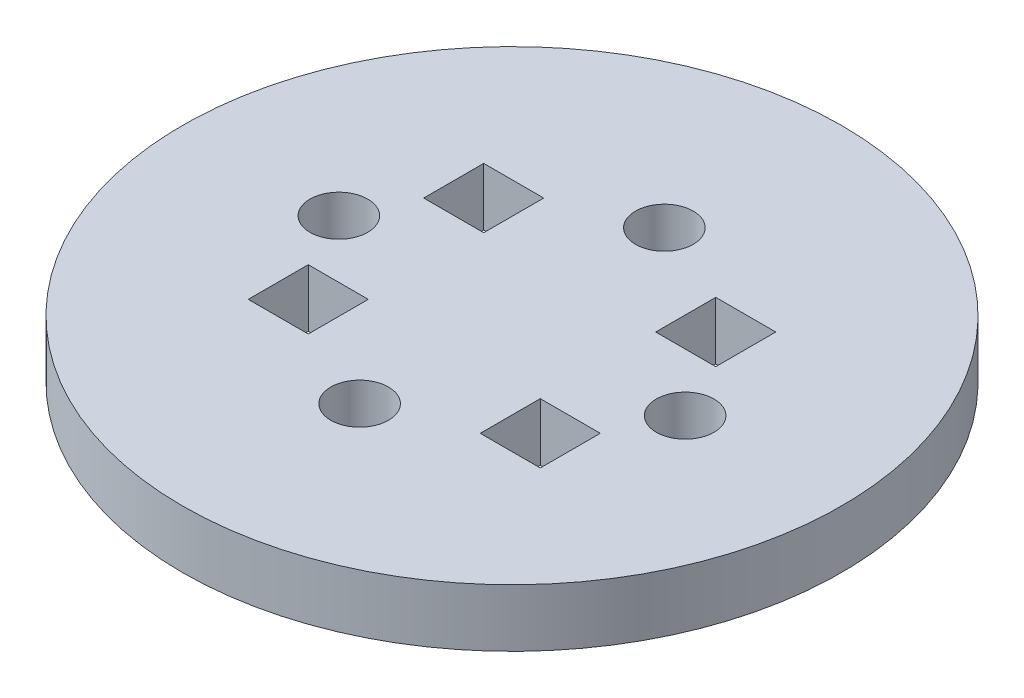
ISO-10303-21;
HEADER;
FILE_DESCRIPTION(('STEP AP214'),'2;1');
FILE_NAME('part.step','',(''),(''),'','','');
FILE_SCHEMA(('AUTOMOTIVE_DESIGN { 1 0 10303 214 1 1 1 1 }'));
ENDSEC;
DATA;
#1=APPLICATION_CONTEXT('core data for automotive mechanical design processes');
#2=APPLICATION_PROTOCOL_DEFINITION('international standard','automotive_design',2000,#1);
#3=PRODUCT_CONTEXT('',#1,'mechanical');
#4=PRODUCT('Part','Part','',(#3));
#5=PRODUCT_RELATED_PRODUCT_CATEGORY('part','',(#4));
#6=PRODUCT_DEFINITION_FORMATION('','',#4);
#7=PRODUCT_DEFINITION_CONTEXT('part definition',#1,'design');
#8=PRODUCT_DEFINITION('design','',#6,#7);
#9=PRODUCT_DEFINITION_SHAPE('','',#8);
#10=(LENGTH_UNIT() NAMED_UNIT(*) SI_UNIT(.MILLI.,.METRE.));
#11=(NAMED_UNIT(*) PLANE_ANGLE_UNIT() SI_UNIT($,.RADIAN.));
#12=(NAMED_UNIT(*) SI_UNIT($,.STERADIAN.) SOLID_ANGLE_UNIT());
#13=UNCERTAINTY_MEASURE_WITH_UNIT(LENGTH_MEASURE(1.E-05),#10,'distance_accuracy_value','');
#14=(GEOMETRIC_REPRESENTATION_CONTEXT(3) GLOBAL_UNCERTAINTY_ASSIGNED_CONTEXT((#13)) GLOBAL_UNIT_ASSIGNED_CONTEXT((#10,
#11,#12)) REPRESENTATION_CONTEXT('',''));
#15=CARTESIAN_POINT('',(0.,0.,0.));
#16=DIRECTION('',(0.,0.,1.));
#17=DIRECTION('',(1.,0.,0.));
#18=AXIS2_PLACEMENT_3D('',#15,#16,#17);
#19=CARTESIAN_POINT('',(0.,6.35,0.));
#20=DIRECTION('',(0.,1.,0.));
#21=DIRECTION('',(0.,0.,1.));
#22=AXIS2_PLACEMENT_3D('',#19,#20,#21);
#23=PLANE('',#22);
#24=DIRECTION('',(0.,0.,-1.));
#25=VECTOR('',#24,1.);
#26=CARTESIAN_POINT('',(-9.4615,6.35,6.35));
#27=LINE('',#26,#25);
#28=CARTESIAN_POINT('',(-9.4615,6.35,12.954));
#29=VERTEX_POINT('',#28);
#30=CARTESIAN_POINT('',(-9.4615,6.35,6.35));
#31=VERTEX_POINT('',#30);
#32=EDGE_CURVE('E56',#29,#31,#27,.T.);
#33=ORIENTED_EDGE('',*,*,#32,.F.);
#34=DIRECTION('',(1.,0.,0.));
#35=VECTOR('',#34,1.);
#36=CARTESIAN_POINT('',(-16.0655,6.35,12.954));
#37=LINE('',#36,#35);
#38=CARTESIAN_POINT('',(-16.0655,6.35,12.954));
#39=VERTEX_POINT('',#38);
#40=EDGE_CURVE('E191',#39,#29,#37,.T.);
#41=ORIENTED_EDGE('',*,*,#40,.F.);
#42=DIRECTION('',(0.,0.,1.));
#43=VECTOR('',#42,1.);
#44=CARTESIAN_POINT('',(-16.0655,6.35,12.954));
#45=LINE('',#44,#43);
#46=CARTESIAN_POINT('',(-16.0655,6.35,6.35));
#47=VERTEX_POINT('',#46);
#48=EDGE_CURVE('E200',#47,#39,#45,.T.);
#49=ORIENTED_EDGE('',*,*,#48,.F.);
#50=DIRECTION('',(-1.,0.,0.));
#51=VECTOR('',#50,1.);
#52=CARTESIAN_POINT('',(-16.0655,6.35,6.35));
#53=LINE('',#52,#51);
#54=EDGE_CURVE('E203',#31,#47,#53,.T.);
#55=ORIENTED_EDGE('',*,*,#54,.F.);
#56=EDGE_LOOP('',(#33,#41,#49,#55));
#57=FACE_BOUND('',#56,.T.);
#58=DIRECTION('',(1.,0.,0.));
#59=VECTOR('',#58,1.);
#60=CARTESIAN_POINT('',(9.4615,6.35,-6.35));
#61=LINE('',#60,#59);
#62=CARTESIAN_POINT('',(9.4615,6.35,-6.35));
#63=VERTEX_POINT('',#62);
#64=CARTESIAN_POINT('',(16.0655,6.35,-6.35));
#65=VERTEX_POINT('',#64);
#66=EDGE_CURVE('E64',#63,#65,#61,.T.);
#67=ORIENTED_EDGE('',*,*,#66,.F.);
#68=DIRECTION('',(0.,0.,1.));
#69=VECTOR('',#68,1.);
#70=CARTESIAN_POINT('',(9.4615,6.35,-12.954));
#71=LINE('',#70,#69);
#72=CARTESIAN_POINT('',(9.4615,6.35,-12.954));
#73=VERTEX_POINT('',#72);
#74=EDGE_CURVE('E210',#73,#63,#71,.T.);
#75=ORIENTED_EDGE('',*,*,#74,.F.);
#76=DIRECTION('',(-1.,0.,0.));
#77=VECTOR('',#76,1.);
#78=CARTESIAN_POINT('',(9.4615,6.35,-12.954));
#79=LINE('',#78,#77);
#80=CARTESIAN_POINT('',(16.0655,6.35,-12.954));
#81=VERTEX_POINT('',#80);
#82=EDGE_CURVE('E216',#81,#73,#79,.T.);
#83=ORIENTED_EDGE('',*,*,#82,.F.);
#84=DIRECTION('',(0.,0.,-1.));
#85=VECTOR('',#84,1.);
#86=CARTESIAN_POINT('',(16.0655,6.35,-6.35));
#87=LINE('',#86,#85);
#88=EDGE_CURVE('E219',#65,#81,#87,.T.);
#89=ORIENTED_EDGE('',*,*,#88,.F.);
#90=EDGE_LOOP('',(#67,#75,#83,#89));
#91=FACE_BOUND('',#90,.T.);
#92=DIRECTION('',(-1.,0.,0.));
#93=VECTOR('',#92,1.);
#94=CARTESIAN_POINT('',(9.4615,6.35,6.35));
#95=LINE('',#94,#93);
#96=CARTESIAN_POINT('',(16.0655,6.35,6.35));
#97=VERTEX_POINT('',#96);
#98=CARTESIAN_POINT('',(9.4615,6.35,6.35));
#99=VERTEX_POINT('',#98);
#100=EDGE_CURVE('E160',#97,#99,#95,.T.);
#101=ORIENTED_EDGE('',*,*,#100,.F.);
#102=DIRECTION('',(0.,0.,-1.));
#103=VECTOR('',#102,1.);
#104=CARTESIAN_POINT('',(16.0655,6.35,6.35));
#105=LINE('',#104,#103);
#106=CARTESIAN_POINT('',(16.0655,6.35,12.954));
#107=VERTEX_POINT('',#106);
#108=EDGE_CURVE('E169',#107,#97,#105,.T.);
#109=ORIENTED_EDGE('',*,*,#108,.F.);
#110=DIRECTION('',(1.,0.,0.));
#111=VECTOR('',#110,1.);
#112=CARTESIAN_POINT('',(9.4615,6.35,12.954));
#113=LINE('',#112,#111);
#114=CARTESIAN_POINT('',(9.4615,6.35,12.954));
#115=VERTEX_POINT('',#114);
#116=EDGE_CURVE('E175',#115,#107,#113,.T.);
#117=ORIENTED_EDGE('',*,*,#116,.F.);
#118=DIRECTION('',(0.,0.,1.));
#119=VECTOR('',#118,1.);
#120=CARTESIAN_POINT('',(9.4615,6.35,6.35));
#121=LINE('',#120,#119);
#122=EDGE_CURVE('E181',#99,#115,#121,.T.);
#123=ORIENTED_EDGE('',*,*,#122,.F.);
#124=EDGE_LOOP('',(#101,#109,#117,#123));
#125=FACE_BOUND('',#124,.T.);
#126=DIRECTION('',(0.,0.,-1.));
#127=VECTOR('',#126,1.);
#128=CARTESIAN_POINT('',(-9.4615,6.35,-12.954));
#129=LINE('',#128,#127);
#130=CARTESIAN_POINT('',(-9.4615,6.35,-6.35));
#131=VERTEX_POINT('',#130);
#132=CARTESIAN_POINT('',(-9.4615,6.35,-12.954));
#133=VERTEX_POINT('',#132);
#134=EDGE_CURVE('E207',#131,#133,#129,.T.);
#135=ORIENTED_EDGE('',*,*,#134,.F.);
#136=DIRECTION('',(1.,0.,0.));
#137=VECTOR('',#136,1.);
#138=CARTESIAN_POINT('',(-16.0655,6.35,-6.35));
#139=LINE('',#138,#137);
#140=CARTESIAN_POINT('',(-16.0655,6.35,-6.35));
#141=VERTEX_POINT('',#140);
#142=EDGE_CURVE('E230',#141,#131,#139,.T.);
#143=ORIENTED_EDGE('',*,*,#142,.F.);
#144=DIRECTION('',(0.,0.,1.));
#145=VECTOR('',#144,1.);
#146=CARTESIAN_POINT('',(-16.0655,6.35,-12.954));
#147=LINE('',#146,#145);
#148=CARTESIAN_POINT('',(-16.0655,6.35,-12.954));
#149=VERTEX_POINT('',#148);
#150=EDGE_CURVE('E227',#149,#141,#147,.T.);
#151=ORIENTED_EDGE('',*,*,#150,.F.);
#152=DIRECTION('',(-1.,0.,0.));
#153=VECTOR('',#152,1.);
#154=CARTESIAN_POINT('',(-16.0655,6.35,-12.954));
#155=LINE('',#154,#153);
#156=EDGE_CURVE('E224',#133,#149,#155,.T.);
#157=ORIENTED_EDGE('',*,*,#156,.F.);
#158=EDGE_LOOP('',(#135,#143,#151,#157));
#159=FACE_BOUND('',#158,.T.);
#160=CARTESIAN_POINT('',(-19.05,6.35,0.));
#161=DIRECTION('',(0.,1.,0.));
#162=DIRECTION('',(0.,0.,1.));
#163=AXIS2_PLACEMENT_3D('',#160,#161,#162);
#164=CIRCLE('',#163,3.175);
#165=CARTESIAN_POINT('',(-19.05,6.35,3.175));
#166=VERTEX_POINT('',#165);
#167=EDGE_CURVE('E249',#166,#166,#164,.T.);
#168=ORIENTED_EDGE('',*,*,#167,.F.);
#169=EDGE_LOOP('',(#168));
#170=FACE_BOUND('',#169,.T.);
#171=CARTESIAN_POINT('',(0.,6.35,-16.764));
#172=DIRECTION('',(0.,1.,0.));
#173=DIRECTION('',(0.,0.,1.));
#174=AXIS2_PLACEMENT_3D('',#171,#172,#173);
#175=CIRCLE('',#174,3.175);
#176=CARTESIAN_POINT('',(0.,6.35,-13.589));
#177=VERTEX_POINT('',#176);
#178=EDGE_CURVE('E261',#177,#177,#175,.T.);
#179=ORIENTED_EDGE('',*,*,#178,.F.);
#180=EDGE_LOOP('',(#179));
#181=FACE_BOUND('',#180,.T.);
#182=CARTESIAN_POINT('',(0.,6.35,0.));
#183=DIRECTION('',(0.,1.,0.));
#184=DIRECTION('',(0.,0.,1.));
#185=AXIS2_PLACEMENT_3D('',#182,#183,#184);
#186=CIRCLE('',#185,36.2585);
#187=CARTESIAN_POINT('',(0.,6.35,36.2585));
#188=VERTEX_POINT('',#187);
#189=EDGE_CURVE('E267',#188,#188,#186,.T.);
#190=ORIENTED_EDGE('',*,*,#189,.T.);
#191=EDGE_LOOP('',(#190));
#192=FACE_BOUND('',#191,.T.);
#193=CARTESIAN_POINT('',(0.,6.35,16.764));
#194=DIRECTION('',(0.,1.,0.));
#195=DIRECTION('',(0.,0.,1.));
#196=AXIS2_PLACEMENT_3D('',#193,#194,#195);
#197=CIRCLE('',#196,3.175);
#198=CARTESIAN_POINT('',(0.,6.35,19.939));
#199=VERTEX_POINT('',#198);
#200=EDGE_CURVE('E255',#199,#199,#197,.T.);
#201=ORIENTED_EDGE('',*,*,#200,.F.);
#202=EDGE_LOOP('',(#201));
#203=FACE_BOUND('',#202,.T.);
#204=CARTESIAN_POINT('',(19.05,6.35,0.));
#205=DIRECTION('',(0.,1.,0.));
#206=DIRECTION('',(0.,0.,1.));
#207=AXIS2_PLACEMENT_3D('',#204,#205,#206);
#208=CIRCLE('',#207,3.17500000000001);
#209=CARTESIAN_POINT('',(19.05,6.35,3.17500000000001));
#210=VERTEX_POINT('',#209);
#211=EDGE_CURVE('E243',#210,#210,#208,.T.);
#212=ORIENTED_EDGE('',*,*,#211,.F.);
#213=EDGE_LOOP('',(#212));
#214=FACE_BOUND('',#213,.T.);
#215=ADVANCED_FACE('F41',(#57,#91,#125,#159,#170,#181,#192,#203,#214),#23,.T.);
#216=CARTESIAN_POINT('',(0.,0.,0.));
#217=DIRECTION('',(0.,1.,0.));
#218=DIRECTION('',(0.,0.,1.));
#219=AXIS2_PLACEMENT_3D('',#216,#217,#218);
#220=PLANE('',#219);
#221=DIRECTION('',(1.,0.,0.));
#222=VECTOR('',#221,1.);
#223=CARTESIAN_POINT('',(0.,0.,12.954));
#224=LINE('',#223,#222);
#225=CARTESIAN_POINT('',(-16.0655,0.,12.954));
#226=VERTEX_POINT('',#225);
#227=CARTESIAN_POINT('',(-9.4615,0.,12.954));
#228=VERTEX_POINT('',#227);
#229=EDGE_CURVE('E49',#226,#228,#224,.T.);
#230=ORIENTED_EDGE('',*,*,#229,.T.);
#231=DIRECTION('',(0.,0.,-1.));
#232=VECTOR('',#231,1.);
#233=CARTESIAN_POINT('',(-9.4615,0.,0.));
#234=LINE('',#233,#232);
#235=CARTESIAN_POINT('',(-9.4615,0.,6.35));
#236=VERTEX_POINT('',#235);
#237=EDGE_CURVE('E11',#228,#236,#234,.T.);
#238=ORIENTED_EDGE('',*,*,#237,.T.);
#239=DIRECTION('',(-1.,0.,0.));
#240=VECTOR('',#239,1.);
#241=CARTESIAN_POINT('',(0.,0.,6.35));
#242=LINE('',#241,#240);
#243=CARTESIAN_POINT('',(-16.0655,0.,6.35));
#244=VERTEX_POINT('',#243);
#245=EDGE_CURVE('E305',#236,#244,#242,.T.);
#246=ORIENTED_EDGE('',*,*,#245,.T.);
#247=DIRECTION('',(0.,0.,1.));
#248=VECTOR('',#247,1.);
#249=CARTESIAN_POINT('',(-16.0655,0.,0.));
#250=LINE('',#249,#248);
#251=EDGE_CURVE('E308',#244,#226,#250,.T.);
#252=ORIENTED_EDGE('',*,*,#251,.T.);
#253=EDGE_LOOP('',(#230,#238,#246,#252));
#254=FACE_BOUND('',#253,.T.);
#255=DIRECTION('',(0.,0.,1.));
#256=VECTOR('',#255,1.);
#257=CARTESIAN_POINT('',(9.4615,0.,0.));
#258=LINE('',#257,#256);
#259=CARTESIAN_POINT('',(9.4615,0.,-12.954));
#260=VERTEX_POINT('',#259);
#261=CARTESIAN_POINT('',(9.4615,0.,-6.35));
#262=VERTEX_POINT('',#261);
#263=EDGE_CURVE('E299',#260,#262,#258,.T.);
#264=ORIENTED_EDGE('',*,*,#263,.T.);
#265=DIRECTION('',(1.,0.,0.));
#266=VECTOR('',#265,1.);
#267=CARTESIAN_POINT('',(0.,0.,-6.35));
#268=LINE('',#267,#266);
#269=CARTESIAN_POINT('',(16.0655,0.,-6.35));
#270=VERTEX_POINT('',#269);
#271=EDGE_CURVE('E302',#262,#270,#268,.T.);
#272=ORIENTED_EDGE('',*,*,#271,.T.);
#273=DIRECTION('',(0.,0.,-1.));
#274=VECTOR('',#273,1.);
#275=CARTESIAN_POINT('',(16.0655,0.,0.));
#276=LINE('',#275,#274);
#277=CARTESIAN_POINT('',(16.0655,0.,-12.954));
#278=VERTEX_POINT('',#277);
#279=EDGE_CURVE('E293',#270,#278,#276,.T.);
#280=ORIENTED_EDGE('',*,*,#279,.T.);
#281=DIRECTION('',(-1.,0.,0.));
#282=VECTOR('',#281,1.);
#283=CARTESIAN_POINT('',(0.,0.,-12.954));
#284=LINE('',#283,#282);
#285=EDGE_CURVE('E296',#278,#260,#284,.T.);
#286=ORIENTED_EDGE('',*,*,#285,.T.);
#287=EDGE_LOOP('',(#264,#272,#280,#286));
#288=FACE_BOUND('',#287,.T.);
#289=DIRECTION('',(0.,0.,-1.));
#290=VECTOR('',#289,1.);
#291=CARTESIAN_POINT('',(16.0655,0.,0.));
#292=LINE('',#291,#290);
#293=CARTESIAN_POINT('',(16.0655,0.,12.954));
#294=VERTEX_POINT('',#293);
#295=CARTESIAN_POINT('',(16.0655,0.,6.35));
#296=VERTEX_POINT('',#295);
#297=EDGE_CURVE('E290',#294,#296,#292,.T.);
#298=ORIENTED_EDGE('',*,*,#297,.T.);
#299=DIRECTION('',(-1.,0.,0.));
#300=VECTOR('',#299,1.);
#301=CARTESIAN_POINT('',(0.,0.,6.35));
#302=LINE('',#301,#300);
#303=CARTESIAN_POINT('',(9.4615,0.,6.35));
#304=VERTEX_POINT('',#303);
#305=EDGE_CURVE('E163',#296,#304,#302,.T.);
#306=ORIENTED_EDGE('',*,*,#305,.T.);
#307=DIRECTION('',(0.,0.,1.));
#308=VECTOR('',#307,1.);
#309=CARTESIAN_POINT('',(9.4615,0.,0.));
#310=LINE('',#309,#308);
#311=CARTESIAN_POINT('',(9.4615,0.,12.954));
#312=VERTEX_POINT('',#311);
#313=EDGE_CURVE('E284',#304,#312,#310,.T.);
#314=ORIENTED_EDGE('',*,*,#313,.T.);
#315=DIRECTION('',(1.,0.,0.));
#316=VECTOR('',#315,1.);
#317=CARTESIAN_POINT('',(0.,0.,12.954));
#318=LINE('',#317,#316);
#319=EDGE_CURVE('E287',#312,#294,#318,.T.);
#320=ORIENTED_EDGE('',*,*,#319,.T.);
#321=EDGE_LOOP('',(#298,#306,#314,#320));
#322=FACE_BOUND('',#321,.T.);
#323=DIRECTION('',(1.,0.,0.));
#324=VECTOR('',#323,1.);
#325=CARTESIAN_POINT('',(0.,0.,-6.35));
#326=LINE('',#325,#324);
#327=CARTESIAN_POINT('',(-16.0655,0.,-6.35));
#328=VERTEX_POINT('',#327);
#329=CARTESIAN_POINT('',(-9.4615,0.,-6.35));
#330=VERTEX_POINT('',#329);
#331=EDGE_CURVE('E278',#328,#330,#326,.T.);
#332=ORIENTED_EDGE('',*,*,#331,.T.);
#333=DIRECTION('',(0.,0.,-1.));
#334=VECTOR('',#333,1.);
#335=CARTESIAN_POINT('',(-9.4615,0.,0.));
#336=LINE('',#335,#334);
#337=CARTESIAN_POINT('',(-9.4615,0.,-12.954));
#338=VERTEX_POINT('',#337);
#339=EDGE_CURVE('E281',#330,#338,#336,.T.);
#340=ORIENTED_EDGE('',*,*,#339,.T.);
#341=DIRECTION('',(-1.,0.,0.));
#342=VECTOR('',#341,1.);
#343=CARTESIAN_POINT('',(0.,0.,-12.954));
#344=LINE('',#343,#342);
#345=CARTESIAN_POINT('',(-16.0655,0.,-12.954));
#346=VERTEX_POINT('',#345);
#347=EDGE_CURVE('E270',#338,#346,#344,.T.);
#348=ORIENTED_EDGE('',*,*,#347,.T.);
#349=DIRECTION('',(0.,0.,1.));
#350=VECTOR('',#349,1.);
#351=CARTESIAN_POINT('',(-16.0655,0.,0.));
#352=LINE('',#351,#350);
#353=EDGE_CURVE('E275',#346,#328,#352,.T.);
#354=ORIENTED_EDGE('',*,*,#353,.T.);
#355=EDGE_LOOP('',(#332,#340,#348,#354));
#356=FACE_BOUND('',#355,.T.);
#357=CARTESIAN_POINT('',(0.,0.,0.));
#358=DIRECTION('',(0.,1.,0.));
#359=DIRECTION('',(0.,0.,1.));
#360=AXIS2_PLACEMENT_3D('',#357,#358,#359);
#361=CIRCLE('',#360,36.2585);
#362=CARTESIAN_POINT('',(0.,0.,36.2585));
#363=VERTEX_POINT('',#362);
#364=EDGE_CURVE('E264',#363,#363,#361,.T.);
#365=ORIENTED_EDGE('',*,*,#364,.F.);
#366=EDGE_LOOP('',(#365));
#367=FACE_BOUND('',#366,.T.);
#368=CARTESIAN_POINT('',(0.,0.,-16.764));
#369=DIRECTION('',(0.,1.,0.));
#370=DIRECTION('',(0.,0.,1.));
#371=AXIS2_PLACEMENT_3D('',#368,#369,#370);
#372=CIRCLE('',#371,3.175);
#373=CARTESIAN_POINT('',(0.,0.,-13.589));
#374=VERTEX_POINT('',#373);
#375=EDGE_CURVE('E258',#374,#374,#372,.T.);
#376=ORIENTED_EDGE('',*,*,#375,.T.);
#377=EDGE_LOOP('',(#376));
#378=FACE_BOUND('',#377,.T.);
#379=CARTESIAN_POINT('',(0.,0.,16.764));
#380=DIRECTION('',(0.,1.,0.));
#381=DIRECTION('',(0.,0.,1.));
#382=AXIS2_PLACEMENT_3D('',#379,#380,#381);
#383=CIRCLE('',#382,3.175);
#384=CARTESIAN_POINT('',(0.,0.,19.939));
#385=VERTEX_POINT('',#384);
#386=EDGE_CURVE('E252',#385,#385,#383,.T.);
#387=ORIENTED_EDGE('',*,*,#386,.T.);
#388=EDGE_LOOP('',(#387));
#389=FACE_BOUND('',#388,.T.);
#390=CARTESIAN_POINT('',(-19.05,0.,0.));
#391=DIRECTION('',(0.,1.,0.));
#392=DIRECTION('',(0.,0.,1.));
#393=AXIS2_PLACEMENT_3D('',#390,#391,#392);
#394=CIRCLE('',#393,3.175);
#395=CARTESIAN_POINT('',(-19.05,0.,3.175));
#396=VERTEX_POINT('',#395);
#397=EDGE_CURVE('E246',#396,#396,#394,.T.);
#398=ORIENTED_EDGE('',*,*,#397,.T.);
#399=EDGE_LOOP('',(#398));
#400=FACE_BOUND('',#399,.T.);
#401=CARTESIAN_POINT('',(19.05,0.,0.));
#402=DIRECTION('',(0.,1.,0.));
#403=DIRECTION('',(0.,0.,1.));
#404=AXIS2_PLACEMENT_3D('',#401,#402,#403);
#405=CIRCLE('',#404,3.17500000000001);
#406=CARTESIAN_POINT('',(19.05,0.,3.17500000000001));
#407=VERTEX_POINT('',#406);
#408=EDGE_CURVE('E236',#407,#407,#405,.T.);
#409=ORIENTED_EDGE('',*,*,#408,.T.);
#410=EDGE_LOOP('',(#409));
#411=FACE_BOUND('',#410,.T.);
#412=ADVANCED_FACE('F312',(#254,#288,#322,#356,#367,#378,#389,#400,#411),#220,.F.);
#413=CARTESIAN_POINT('',(0.,6.35,0.));
#414=DIRECTION('',(0.,-1.,0.));
#415=DIRECTION('',(0.,0.,-1.));
#416=AXIS2_PLACEMENT_3D('',#413,#414,#415);
#417=CYLINDRICAL_SURFACE('',#416,36.2585);
#418=ORIENTED_EDGE('',*,*,#189,.F.);
#419=EDGE_LOOP('',(#418));
#420=FACE_BOUND('',#419,.T.);
#421=ORIENTED_EDGE('',*,*,#364,.T.);
#422=EDGE_LOOP('',(#421));
#423=FACE_BOUND('',#422,.T.);
#424=ADVANCED_FACE('F43',(#420,#423),#417,.T.);
#425=CARTESIAN_POINT('',(0.,6.35,-16.764));
#426=DIRECTION('',(0.,-1.,0.));
#427=DIRECTION('',(0.,0.,-1.));
#428=AXIS2_PLACEMENT_3D('',#425,#426,#427);
#429=CYLINDRICAL_SURFACE('',#428,3.175);
#430=ORIENTED_EDGE('',*,*,#178,.T.);
#431=EDGE_LOOP('',(#430));
#432=FACE_BOUND('',#431,.T.);
#433=ORIENTED_EDGE('',*,*,#375,.F.);
#434=EDGE_LOOP('',(#433));
#435=FACE_BOUND('',#434,.T.);
#436=ADVANCED_FACE('F349',(#432,#435),#429,.F.);
#437=CARTESIAN_POINT('',(0.,6.35,16.764));
#438=DIRECTION('',(0.,-1.,0.));
#439=DIRECTION('',(0.,0.,-1.));
#440=AXIS2_PLACEMENT_3D('',#437,#438,#439);
#441=CYLINDRICAL_SURFACE('',#440,3.175);
#442=ORIENTED_EDGE('',*,*,#200,.T.);
#443=EDGE_LOOP('',(#442));
#444=FACE_BOUND('',#443,.T.);
#445=ORIENTED_EDGE('',*,*,#386,.F.);
#446=EDGE_LOOP('',(#445));
#447=FACE_BOUND('',#446,.T.);
#448=ADVANCED_FACE('F352',(#444,#447),#441,.F.);
#449=CARTESIAN_POINT('',(-19.05,6.35,0.));
#450=DIRECTION('',(0.,-1.,0.));
#451=DIRECTION('',(0.,0.,-1.));
#452=AXIS2_PLACEMENT_3D('',#449,#450,#451);
#453=CYLINDRICAL_SURFACE('',#452,3.175);
#454=ORIENTED_EDGE('',*,*,#167,.T.);
#455=EDGE_LOOP('',(#454));
#456=FACE_BOUND('',#455,.T.);
#457=ORIENTED_EDGE('',*,*,#397,.F.);
#458=EDGE_LOOP('',(#457));
#459=FACE_BOUND('',#458,.T.);
#460=ADVANCED_FACE('F356',(#456,#459),#453,.F.);
#461=CARTESIAN_POINT('',(19.05,6.35,0.));
#462=DIRECTION('',(0.,-1.,0.));
#463=DIRECTION('',(0.,0.,-1.));
#464=AXIS2_PLACEMENT_3D('',#461,#462,#463);
#465=CYLINDRICAL_SURFACE('',#464,3.17500000000001);
#466=ORIENTED_EDGE('',*,*,#211,.T.);
#467=EDGE_LOOP('',(#466));
#468=FACE_BOUND('',#467,.T.);
#469=ORIENTED_EDGE('',*,*,#408,.F.);
#470=EDGE_LOOP('',(#469));
#471=FACE_BOUND('',#470,.T.);
#472=ADVANCED_FACE('F360',(#468,#471),#465,.F.);
#473=CARTESIAN_POINT('',(-9.4615,-3.81,-12.954));
#474=DIRECTION('',(1.,0.,0.));
#475=DIRECTION('',(0.,0.,-1.));
#476=AXIS2_PLACEMENT_3D('',#473,#474,#475);
#477=PLANE('',#476);
#478=DIRECTION('',(0.,1.,0.));
#479=VECTOR('',#478,1.);
#480=CARTESIAN_POINT('',(-9.4615,-3.81,-6.35));
#481=LINE('',#480,#479);
#482=EDGE_CURVE('E234',#330,#131,#481,.T.);
#483=ORIENTED_EDGE('',*,*,#482,.T.);
#484=ORIENTED_EDGE('',*,*,#134,.T.);
#485=DIRECTION('',(0.,1.,0.));
#486=VECTOR('',#485,1.);
#487=CARTESIAN_POINT('',(-9.4615,-3.81,-12.954));
#488=LINE('',#487,#486);
#489=EDGE_CURVE('E233',#338,#133,#488,.T.);
#490=ORIENTED_EDGE('',*,*,#489,.F.);
#491=ORIENTED_EDGE('',*,*,#339,.F.);
#492=EDGE_LOOP('',(#483,#484,#490,#491));
#493=FACE_BOUND('',#492,.T.);
#494=ADVANCED_FACE('F364',(#493),#477,.F.);
#495=CARTESIAN_POINT('',(-16.0655,-3.81,-6.35));
#496=DIRECTION('',(0.,0.,1.));
#497=DIRECTION('',(1.,0.,0.));
#498=AXIS2_PLACEMENT_3D('',#495,#496,#497);
#499=PLANE('',#498);
#500=DIRECTION('',(0.,1.,0.));
#501=VECTOR('',#500,1.);
#502=CARTESIAN_POINT('',(-16.0655,-3.81,-6.35));
#503=LINE('',#502,#501);
#504=EDGE_CURVE('E237',#328,#141,#503,.T.);
#505=ORIENTED_EDGE('',*,*,#504,.T.);
#506=ORIENTED_EDGE('',*,*,#142,.T.);
#507=ORIENTED_EDGE('',*,*,#482,.F.);
#508=ORIENTED_EDGE('',*,*,#331,.F.);
#509=EDGE_LOOP('',(#505,#506,#507,#508));
#510=FACE_BOUND('',#509,.T.);
#511=ADVANCED_FACE('F368',(#510),#499,.F.);
#512=CARTESIAN_POINT('',(-16.0655,-3.81,-12.954));
#513=DIRECTION('',(-1.,0.,0.));
#514=DIRECTION('',(0.,0.,1.));
#515=AXIS2_PLACEMENT_3D('',#512,#513,#514);
#516=PLANE('',#515);
#517=DIRECTION('',(0.,1.,0.));
#518=VECTOR('',#517,1.);
#519=CARTESIAN_POINT('',(-16.0655,-3.81,-12.954));
#520=LINE('',#519,#518);
#521=EDGE_CURVE('E239',#346,#149,#520,.T.);
#522=ORIENTED_EDGE('',*,*,#521,.T.);
#523=ORIENTED_EDGE('',*,*,#150,.T.);
#524=ORIENTED_EDGE('',*,*,#504,.F.);
#525=ORIENTED_EDGE('',*,*,#353,.F.);
#526=EDGE_LOOP('',(#522,#523,#524,#525));
#527=FACE_BOUND('',#526,.T.);
#528=ADVANCED_FACE('F373',(#527),#516,.F.);
#529=CARTESIAN_POINT('',(-16.0655,-3.81,-12.954));
#530=DIRECTION('',(0.,0.,-1.));
#531=DIRECTION('',(-1.,0.,0.));
#532=AXIS2_PLACEMENT_3D('',#529,#530,#531);
#533=PLANE('',#532);
#534=ORIENTED_EDGE('',*,*,#489,.T.);
#535=ORIENTED_EDGE('',*,*,#156,.T.);
#536=ORIENTED_EDGE('',*,*,#521,.F.);
#537=ORIENTED_EDGE('',*,*,#347,.F.);
#538=EDGE_LOOP('',(#534,#535,#536,#537));
#539=FACE_BOUND('',#538,.T.);
#540=ADVANCED_FACE('F370',(#539),#533,.F.);
#541=CARTESIAN_POINT('',(9.4615,-3.81,6.35));
#542=DIRECTION('',(0.,0.,-1.));
#543=DIRECTION('',(-1.,0.,0.));
#544=AXIS2_PLACEMENT_3D('',#541,#542,#543);
#545=PLANE('',#544);
#546=DIRECTION('',(0.,1.,0.));
#547=VECTOR('',#546,1.);
#548=CARTESIAN_POINT('',(16.0655,-3.81,6.35));
#549=LINE('',#548,#547);
#550=EDGE_CURVE('E155',#296,#97,#549,.T.);
#551=ORIENTED_EDGE('',*,*,#550,.T.);
#552=ORIENTED_EDGE('',*,*,#100,.T.);
#553=DIRECTION('',(0.,1.,0.));
#554=VECTOR('',#553,1.);
#555=CARTESIAN_POINT('',(9.4615,-3.81,6.35));
#556=LINE('',#555,#554);
#557=EDGE_CURVE('E176',#304,#99,#556,.T.);
#558=ORIENTED_EDGE('',*,*,#557,.F.);
#559=ORIENTED_EDGE('',*,*,#305,.F.);
#560=EDGE_LOOP('',(#551,#552,#558,#559));
#561=FACE_BOUND('',#560,.T.);
#562=ADVANCED_FACE('F157',(#561),#545,.F.);
#563=CARTESIAN_POINT('',(16.0655,-3.81,6.35));
#564=DIRECTION('',(1.,0.,0.));
#565=DIRECTION('',(0.,0.,-1.));
#566=AXIS2_PLACEMENT_3D('',#563,#564,#565);
#567=PLANE('',#566);
#568=DIRECTION('',(0.,1.,0.));
#569=VECTOR('',#568,1.);
#570=CARTESIAN_POINT('',(16.0655,-3.81,12.954));
#571=LINE('',#570,#569);
#572=EDGE_CURVE('E166',#294,#107,#571,.T.);
#573=ORIENTED_EDGE('',*,*,#572,.T.);
#574=ORIENTED_EDGE('',*,*,#108,.T.);
#575=ORIENTED_EDGE('',*,*,#550,.F.);
#576=ORIENTED_EDGE('',*,*,#297,.F.);
#577=EDGE_LOOP('',(#573,#574,#575,#576));
#578=FACE_BOUND('',#577,.T.);
#579=ADVANCED_FACE('F170',(#578),#567,.F.);
#580=CARTESIAN_POINT('',(9.4615,-3.81,12.954));
#581=DIRECTION('',(0.,0.,1.));
#582=DIRECTION('',(1.,0.,0.));
#583=AXIS2_PLACEMENT_3D('',#580,#581,#582);
#584=PLANE('',#583);
#585=DIRECTION('',(0.,1.,0.));
#586=VECTOR('',#585,1.);
#587=CARTESIAN_POINT('',(9.4615,-3.81,12.954));
#588=LINE('',#587,#586);
#589=EDGE_CURVE('E607',#312,#115,#588,.T.);
#590=ORIENTED_EDGE('',*,*,#589,.T.);
#591=ORIENTED_EDGE('',*,*,#116,.T.);
#592=ORIENTED_EDGE('',*,*,#572,.F.);
#593=ORIENTED_EDGE('',*,*,#319,.F.);
#594=EDGE_LOOP('',(#590,#591,#592,#593));
#595=FACE_BOUND('',#594,.T.);
#596=ADVANCED_FACE('F447',(#595),#584,.F.);
#597=CARTESIAN_POINT('',(9.4615,-3.81,6.35));
#598=DIRECTION('',(-1.,0.,0.));
#599=DIRECTION('',(0.,0.,1.));
#600=AXIS2_PLACEMENT_3D('',#597,#598,#599);
#601=PLANE('',#600);
#602=ORIENTED_EDGE('',*,*,#557,.T.);
#603=ORIENTED_EDGE('',*,*,#122,.T.);
#604=ORIENTED_EDGE('',*,*,#589,.F.);
#605=ORIENTED_EDGE('',*,*,#313,.F.);
#606=EDGE_LOOP('',(#602,#603,#604,#605));
#607=FACE_BOUND('',#606,.T.);
#608=ADVANCED_FACE('F390',(#607),#601,.F.);
#609=CARTESIAN_POINT('',(9.4615,-3.81,-6.35));
#610=DIRECTION('',(0.,0.,1.));
#611=DIRECTION('',(1.,0.,0.));
#612=AXIS2_PLACEMENT_3D('',#609,#610,#611);
#613=PLANE('',#612);
#614=DIRECTION('',(0.,1.,0.));
#615=VECTOR('',#614,1.);
#616=CARTESIAN_POINT('',(9.4615,-3.81,-6.35));
#617=LINE('',#616,#615);
#618=EDGE_CURVE('E182',#262,#63,#617,.T.);
#619=ORIENTED_EDGE('',*,*,#618,.T.);
#620=ORIENTED_EDGE('',*,*,#66,.T.);
#621=DIRECTION('',(0.,1.,0.));
#622=VECTOR('',#621,1.);
#623=CARTESIAN_POINT('',(16.0655,-3.81,-6.35));
#624=LINE('',#623,#622);
#625=EDGE_CURVE('E208',#270,#65,#624,.T.);
#626=ORIENTED_EDGE('',*,*,#625,.F.);
#627=ORIENTED_EDGE('',*,*,#271,.F.);
#628=EDGE_LOOP('',(#619,#620,#626,#627));
#629=FACE_BOUND('',#628,.T.);
#630=ADVANCED_FACE('F384',(#629),#613,.F.);
#631=CARTESIAN_POINT('',(9.4615,-3.81,-12.954));
#632=DIRECTION('',(-1.,0.,0.));
#633=DIRECTION('',(0.,0.,1.));
#634=AXIS2_PLACEMENT_3D('',#631,#632,#633);
#635=PLANE('',#634);
#636=DIRECTION('',(0.,1.,0.));
#637=VECTOR('',#636,1.);
#638=CARTESIAN_POINT('',(9.4615,-3.81,-12.954));
#639=LINE('',#638,#637);
#640=EDGE_CURVE('E184',#260,#73,#639,.T.);
#641=ORIENTED_EDGE('',*,*,#640,.T.);
#642=ORIENTED_EDGE('',*,*,#74,.T.);
#643=ORIENTED_EDGE('',*,*,#618,.F.);
#644=ORIENTED_EDGE('',*,*,#263,.F.);
#645=EDGE_LOOP('',(#641,#642,#643,#644));
#646=FACE_BOUND('',#645,.T.);
#647=ADVANCED_FACE('F381',(#646),#635,.F.);
#648=CARTESIAN_POINT('',(9.4615,-3.81,-12.954));
#649=DIRECTION('',(0.,0.,-1.));
#650=DIRECTION('',(-1.,0.,0.));
#651=AXIS2_PLACEMENT_3D('',#648,#649,#650);
#652=PLANE('',#651);
#653=DIRECTION('',(0.,1.,0.));
#654=VECTOR('',#653,1.);
#655=CARTESIAN_POINT('',(16.0655,-3.81,-12.954));
#656=LINE('',#655,#654);
#657=EDGE_CURVE('E211',#278,#81,#656,.T.);
#658=ORIENTED_EDGE('',*,*,#657,.T.);
#659=ORIENTED_EDGE('',*,*,#82,.T.);
#660=ORIENTED_EDGE('',*,*,#640,.F.);
#661=ORIENTED_EDGE('',*,*,#285,.F.);
#662=EDGE_LOOP('',(#658,#659,#660,#661));
#663=FACE_BOUND('',#662,.T.);
#664=ADVANCED_FACE('F337',(#663),#652,.F.);
#665=CARTESIAN_POINT('',(16.0655,-3.81,-6.35));
#666=DIRECTION('',(1.,0.,0.));
#667=DIRECTION('',(0.,0.,-1.));
#668=AXIS2_PLACEMENT_3D('',#665,#666,#667);
#669=PLANE('',#668);
#670=ORIENTED_EDGE('',*,*,#625,.T.);
#671=ORIENTED_EDGE('',*,*,#88,.T.);
#672=ORIENTED_EDGE('',*,*,#657,.F.);
#673=ORIENTED_EDGE('',*,*,#279,.F.);
#674=EDGE_LOOP('',(#670,#671,#672,#673));
#675=FACE_BOUND('',#674,.T.);
#676=ADVANCED_FACE('F330',(#675),#669,.F.);
#677=CARTESIAN_POINT('',(-9.4615,-3.81,6.35));
#678=DIRECTION('',(1.,0.,0.));
#679=DIRECTION('',(0.,0.,-1.));
#680=AXIS2_PLACEMENT_3D('',#677,#678,#679);
#681=PLANE('',#680);
#682=DIRECTION('',(0.,1.,0.));
#683=VECTOR('',#682,1.);
#684=CARTESIAN_POINT('',(-9.4615,-3.81,12.954));
#685=LINE('',#684,#683);
#686=EDGE_CURVE('E196',#228,#29,#685,.T.);
#687=ORIENTED_EDGE('',*,*,#686,.T.);
#688=ORIENTED_EDGE('',*,*,#32,.T.);
#689=DIRECTION('',(0.,1.,0.));
#690=VECTOR('',#689,1.);
#691=CARTESIAN_POINT('',(-9.4615,-3.81,6.35));
#692=LINE('',#691,#690);
#693=EDGE_CURVE('E189',#236,#31,#692,.T.);
#694=ORIENTED_EDGE('',*,*,#693,.F.);
#695=ORIENTED_EDGE('',*,*,#237,.F.);
#696=EDGE_LOOP('',(#687,#688,#694,#695));
#697=FACE_BOUND('',#696,.T.);
#698=ADVANCED_FACE('F328',(#697),#681,.F.);
#699=CARTESIAN_POINT('',(-16.0655,-3.81,12.954));
#700=DIRECTION('',(0.,0.,1.));
#701=DIRECTION('',(1.,0.,0.));
#702=AXIS2_PLACEMENT_3D('',#699,#700,#701);
#703=PLANE('',#702);
#704=DIRECTION('',(0.,1.,0.));
#705=VECTOR('',#704,1.);
#706=CARTESIAN_POINT('',(-16.0655,-3.81,12.954));
#707=LINE('',#706,#705);
#708=EDGE_CURVE('E194',#226,#39,#707,.T.);
#709=ORIENTED_EDGE('',*,*,#708,.T.);
#710=ORIENTED_EDGE('',*,*,#40,.T.);
#711=ORIENTED_EDGE('',*,*,#686,.F.);
#712=ORIENTED_EDGE('',*,*,#229,.F.);
#713=EDGE_LOOP('',(#709,#710,#711,#712));
#714=FACE_BOUND('',#713,.T.);
#715=ADVANCED_FACE('F318',(#714),#703,.F.);
#716=CARTESIAN_POINT('',(-16.0655,-3.81,12.954));
#717=DIRECTION('',(-1.,0.,0.));
#718=DIRECTION('',(0.,0.,1.));
#719=AXIS2_PLACEMENT_3D('',#716,#717,#718);
#720=PLANE('',#719);
#721=DIRECTION('',(0.,1.,0.));
#722=VECTOR('',#721,1.);
#723=CARTESIAN_POINT('',(-16.0655,-3.81,6.35));
#724=LINE('',#723,#722);
#725=EDGE_CURVE('E192',#244,#47,#724,.T.);
#726=ORIENTED_EDGE('',*,*,#725,.T.);
#727=ORIENTED_EDGE('',*,*,#48,.T.);
#728=ORIENTED_EDGE('',*,*,#708,.F.);
#729=ORIENTED_EDGE('',*,*,#251,.F.);
#730=EDGE_LOOP('',(#726,#727,#728,#729));
#731=FACE_BOUND('',#730,.T.);
#732=ADVANCED_FACE('F320',(#731),#720,.F.);
#733=CARTESIAN_POINT('',(-16.0655,-3.81,6.35));
#734=DIRECTION('',(0.,0.,-1.));
#735=DIRECTION('',(-1.,0.,0.));
#736=AXIS2_PLACEMENT_3D('',#733,#734,#735);
#737=PLANE('',#736);
#738=ORIENTED_EDGE('',*,*,#693,.T.);
#739=ORIENTED_EDGE('',*,*,#54,.T.);
#740=ORIENTED_EDGE('',*,*,#725,.F.);
#741=ORIENTED_EDGE('',*,*,#245,.F.);
#742=EDGE_LOOP('',(#738,#739,#740,#741));
#743=FACE_BOUND('',#742,.T.);
#744=ADVANCED_FACE('F327',(#743),#737,.F.);
#745=CLOSED_SHELL('',(#215,#412,#424,#436,#448,#460,#472,#494,#511,#528,#540,#562,#579,#596,
#608,#630,#647,#664,#676,#698,#715,#732,#744));
#746=MANIFOLD_SOLID_BREP('B2',#745);
#747=ADVANCED_BREP_SHAPE_REPRESENTATION('',(#18,#746),#14);
#748=SHAPE_DEFINITION_REPRESENTATION(#9,#747);
ENDSEC;
END-ISO-10303-21;
